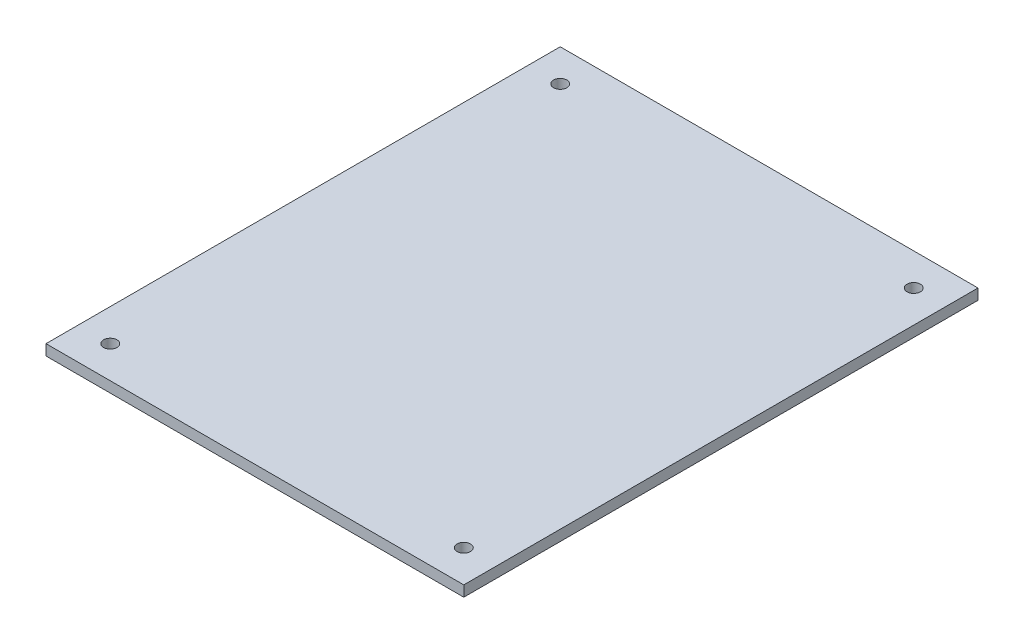
ISO-10303-21;
HEADER;
FILE_DESCRIPTION(('STEP AP214'),'2;1');
FILE_NAME('part.step','',(''),(''),'','','');
FILE_SCHEMA(('AUTOMOTIVE_DESIGN { 1 0 10303 214 1 1 1 1 }'));
ENDSEC;
DATA;
#1=APPLICATION_CONTEXT('core data for automotive mechanical design processes');
#2=APPLICATION_PROTOCOL_DEFINITION('international standard','automotive_design',2000,#1);
#3=PRODUCT_CONTEXT('',#1,'mechanical');
#4=PRODUCT('Part','Part','',(#3));
#5=PRODUCT_RELATED_PRODUCT_CATEGORY('part','',(#4));
#6=PRODUCT_DEFINITION_FORMATION('','',#4);
#7=PRODUCT_DEFINITION_CONTEXT('part definition',#1,'design');
#8=PRODUCT_DEFINITION('design','',#6,#7);
#9=PRODUCT_DEFINITION_SHAPE('','',#8);
#10=(LENGTH_UNIT() NAMED_UNIT(*) SI_UNIT(.MILLI.,.METRE.));
#11=(NAMED_UNIT(*) PLANE_ANGLE_UNIT() SI_UNIT($,.RADIAN.));
#12=(NAMED_UNIT(*) SI_UNIT($,.STERADIAN.) SOLID_ANGLE_UNIT());
#13=UNCERTAINTY_MEASURE_WITH_UNIT(LENGTH_MEASURE(1.E-05),#10,'distance_accuracy_value','');
#14=(GEOMETRIC_REPRESENTATION_CONTEXT(3) GLOBAL_UNCERTAINTY_ASSIGNED_CONTEXT((#13)) GLOBAL_UNIT_ASSIGNED_CONTEXT((#10,
#11,#12)) REPRESENTATION_CONTEXT('',''));
#15=CARTESIAN_POINT('',(0.,0.,0.));
#16=DIRECTION('',(0.,0.,1.));
#17=DIRECTION('',(1.,0.,0.));
#18=AXIS2_PLACEMENT_3D('',#15,#16,#17);
#19=CARTESIAN_POINT('',(0.,2.54,0.));
#20=DIRECTION('',(0.,1.,0.));
#21=DIRECTION('',(0.,0.,1.));
#22=AXIS2_PLACEMENT_3D('',#19,#20,#21);
#23=PLANE('',#22);
#24=CARTESIAN_POINT('',(-49.6099010012668,2.54,45.3396006384747));
#25=DIRECTION('',(0.,1.,0.));
#26=DIRECTION('',(0.,0.,1.));
#27=AXIS2_PLACEMENT_3D('',#24,#25,#26);
#28=CIRCLE('',#27,1.5875);
#29=CARTESIAN_POINT('',(-49.6099010012668,2.54,46.9271006384747));
#30=VERTEX_POINT('',#29);
#31=EDGE_CURVE('E142',#30,#30,#28,.T.);
#32=ORIENTED_EDGE('',*,*,#31,.F.);
#33=EDGE_LOOP('',(#32));
#34=FACE_BOUND('',#33,.T.);
#35=CARTESIAN_POINT('',(34.2100989987332,2.54,-61.3403993615253));
#36=DIRECTION('',(0.,1.,0.));
#37=DIRECTION('',(0.,0.,1.));
#38=AXIS2_PLACEMENT_3D('',#35,#36,#37);
#39=CIRCLE('',#38,1.5875);
#40=CARTESIAN_POINT('',(34.2100989987332,2.54,-59.7528993615253));
#41=VERTEX_POINT('',#40);
#42=EDGE_CURVE('E112',#41,#41,#39,.T.);
#43=ORIENTED_EDGE('',*,*,#42,.F.);
#44=EDGE_LOOP('',(#43));
#45=FACE_BOUND('',#44,.T.);
#46=DIRECTION('',(0.,0.,1.));
#47=VECTOR('',#46,1.);
#48=CARTESIAN_POINT('',(-57.2299010012668,2.54,-68.9603993615253));
#49=LINE('',#48,#47);
#50=CARTESIAN_POINT('',(-57.2299010012668,2.54,-68.9603993615253));
#51=VERTEX_POINT('',#50);
#52=CARTESIAN_POINT('',(-57.2299010012668,2.54,52.9596006384747));
#53=VERTEX_POINT('',#52);
#54=EDGE_CURVE('E92',#51,#53,#49,.T.);
#55=ORIENTED_EDGE('',*,*,#54,.T.);
#56=DIRECTION('',(1.,0.,0.));
#57=VECTOR('',#56,1.);
#58=CARTESIAN_POINT('',(-57.2299010012668,2.54,52.9596006384747));
#59=LINE('',#58,#57);
#60=CARTESIAN_POINT('',(41.8300989987332,2.54,52.9596006384747));
#61=VERTEX_POINT('',#60);
#62=EDGE_CURVE('E87',#53,#61,#59,.T.);
#63=ORIENTED_EDGE('',*,*,#62,.T.);
#64=DIRECTION('',(0.,0.,-1.));
#65=VECTOR('',#64,1.);
#66=CARTESIAN_POINT('',(41.8300989987332,2.54,-68.9603993615253));
#67=LINE('',#66,#65);
#68=CARTESIAN_POINT('',(41.8300989987332,2.54,-68.9603993615253));
#69=VERTEX_POINT('',#68);
#70=EDGE_CURVE('E90',#61,#69,#67,.T.);
#71=ORIENTED_EDGE('',*,*,#70,.T.);
#72=DIRECTION('',(-1.,0.,0.));
#73=VECTOR('',#72,1.);
#74=CARTESIAN_POINT('',(-57.2299010012668,2.54,-68.9603993615253));
#75=LINE('',#74,#73);
#76=EDGE_CURVE('E57',#69,#51,#75,.T.);
#77=ORIENTED_EDGE('',*,*,#76,.T.);
#78=EDGE_LOOP('',(#55,#63,#71,#77));
#79=FACE_BOUND('',#78,.T.);
#80=CARTESIAN_POINT('',(-49.6099010012668,2.54,-61.3403993615253));
#81=DIRECTION('',(0.,1.,0.));
#82=DIRECTION('',(0.,0.,1.));
#83=AXIS2_PLACEMENT_3D('',#80,#81,#82);
#84=CIRCLE('',#83,1.5875);
#85=CARTESIAN_POINT('',(-49.6099010012668,2.54,-59.7528993615253));
#86=VERTEX_POINT('',#85);
#87=EDGE_CURVE('E134',#86,#86,#84,.T.);
#88=ORIENTED_EDGE('',*,*,#87,.F.);
#89=EDGE_LOOP('',(#88));
#90=FACE_BOUND('',#89,.T.);
#91=CARTESIAN_POINT('',(34.2100989987332,2.54,45.3396006384747));
#92=DIRECTION('',(0.,1.,0.));
#93=DIRECTION('',(0.,0.,1.));
#94=AXIS2_PLACEMENT_3D('',#91,#92,#93);
#95=CIRCLE('',#94,1.5875);
#96=CARTESIAN_POINT('',(34.2100989987332,2.54,46.9271006384747));
#97=VERTEX_POINT('',#96);
#98=EDGE_CURVE('E150',#97,#97,#95,.T.);
#99=ORIENTED_EDGE('',*,*,#98,.F.);
#100=EDGE_LOOP('',(#99));
#101=FACE_BOUND('',#100,.T.);
#102=ADVANCED_FACE('F39',(#34,#45,#79,#90,#101),#23,.T.);
#103=CARTESIAN_POINT('',(0.,0.,0.));
#104=DIRECTION('',(0.,1.,0.));
#105=DIRECTION('',(0.,0.,1.));
#106=AXIS2_PLACEMENT_3D('',#103,#104,#105);
#107=PLANE('',#106);
#108=DIRECTION('',(0.,0.,1.));
#109=VECTOR('',#108,1.);
#110=CARTESIAN_POINT('',(-57.2299010012668,0.,-68.9603993615253));
#111=LINE('',#110,#109);
#112=CARTESIAN_POINT('',(-57.2299010012668,0.,-68.9603993615253));
#113=VERTEX_POINT('',#112);
#114=CARTESIAN_POINT('',(-57.2299010012668,0.,52.9596006384747));
#115=VERTEX_POINT('',#114);
#116=EDGE_CURVE('E108',#113,#115,#111,.T.);
#117=ORIENTED_EDGE('',*,*,#116,.F.);
#118=DIRECTION('',(-1.,0.,0.));
#119=VECTOR('',#118,1.);
#120=CARTESIAN_POINT('',(-57.2299010012668,0.,-68.9603993615253));
#121=LINE('',#120,#119);
#122=CARTESIAN_POINT('',(41.8300989987332,0.,-68.9603993615253));
#123=VERTEX_POINT('',#122);
#124=EDGE_CURVE('E80',#123,#113,#121,.T.);
#125=ORIENTED_EDGE('',*,*,#124,.F.);
#126=DIRECTION('',(0.,0.,-1.));
#127=VECTOR('',#126,1.);
#128=CARTESIAN_POINT('',(41.8300989987332,0.,-68.9603993615253));
#129=LINE('',#128,#127);
#130=CARTESIAN_POINT('',(41.8300989987332,0.,52.9596006384747));
#131=VERTEX_POINT('',#130);
#132=EDGE_CURVE('E74',#131,#123,#129,.T.);
#133=ORIENTED_EDGE('',*,*,#132,.F.);
#134=DIRECTION('',(1.,0.,0.));
#135=VECTOR('',#134,1.);
#136=CARTESIAN_POINT('',(-57.2299010012668,0.,52.9596006384747));
#137=LINE('',#136,#135);
#138=EDGE_CURVE('E97',#115,#131,#137,.T.);
#139=ORIENTED_EDGE('',*,*,#138,.F.);
#140=EDGE_LOOP('',(#117,#125,#133,#139));
#141=FACE_BOUND('',#140,.T.);
#142=CARTESIAN_POINT('',(34.2100989987332,0.,-61.3403993615253));
#143=DIRECTION('',(0.,1.,0.));
#144=DIRECTION('',(0.,0.,1.));
#145=AXIS2_PLACEMENT_3D('',#142,#143,#144);
#146=CIRCLE('',#145,1.5875);
#147=CARTESIAN_POINT('',(34.2100989987332,0.,-59.7528993615253));
#148=VERTEX_POINT('',#147);
#149=EDGE_CURVE('E130',#148,#148,#146,.T.);
#150=ORIENTED_EDGE('',*,*,#149,.T.);
#151=EDGE_LOOP('',(#150));
#152=FACE_BOUND('',#151,.T.);
#153=CARTESIAN_POINT('',(-49.6099010012668,0.,-61.3403993615253));
#154=DIRECTION('',(0.,1.,0.));
#155=DIRECTION('',(0.,0.,1.));
#156=AXIS2_PLACEMENT_3D('',#153,#154,#155);
#157=CIRCLE('',#156,1.5875);
#158=CARTESIAN_POINT('',(-49.6099010012668,0.,-59.7528993615253));
#159=VERTEX_POINT('',#158);
#160=EDGE_CURVE('E138',#159,#159,#157,.T.);
#161=ORIENTED_EDGE('',*,*,#160,.T.);
#162=EDGE_LOOP('',(#161));
#163=FACE_BOUND('',#162,.T.);
#164=CARTESIAN_POINT('',(-49.6099010012668,0.,45.3396006384747));
#165=DIRECTION('',(0.,1.,0.));
#166=DIRECTION('',(0.,0.,1.));
#167=AXIS2_PLACEMENT_3D('',#164,#165,#166);
#168=CIRCLE('',#167,1.5875);
#169=CARTESIAN_POINT('',(-49.6099010012668,0.,46.9271006384747));
#170=VERTEX_POINT('',#169);
#171=EDGE_CURVE('E146',#170,#170,#168,.T.);
#172=ORIENTED_EDGE('',*,*,#171,.T.);
#173=EDGE_LOOP('',(#172));
#174=FACE_BOUND('',#173,.T.);
#175=CARTESIAN_POINT('',(34.2100989987332,0.,45.3396006384747));
#176=DIRECTION('',(0.,1.,0.));
#177=DIRECTION('',(0.,0.,1.));
#178=AXIS2_PLACEMENT_3D('',#175,#176,#177);
#179=CIRCLE('',#178,1.5875);
#180=CARTESIAN_POINT('',(34.2100989987332,0.,46.9271006384747));
#181=VERTEX_POINT('',#180);
#182=EDGE_CURVE('E154',#181,#181,#179,.T.);
#183=ORIENTED_EDGE('',*,*,#182,.T.);
#184=EDGE_LOOP('',(#183));
#185=FACE_BOUND('',#184,.T.);
#186=ADVANCED_FACE('F125',(#141,#152,#163,#174,#185),#107,.F.);
#187=CARTESIAN_POINT('',(-57.2299010012668,2.54,-68.9603993615253));
#188=DIRECTION('',(1.,0.,0.));
#189=DIRECTION('',(0.,0.,-1.));
#190=AXIS2_PLACEMENT_3D('',#187,#188,#189);
#191=PLANE('',#190);
#192=ORIENTED_EDGE('',*,*,#116,.T.);
#193=DIRECTION('',(0.,-1.,0.));
#194=VECTOR('',#193,1.);
#195=CARTESIAN_POINT('',(-57.2299010012668,2.54,52.9596006384747));
#196=LINE('',#195,#194);
#197=EDGE_CURVE('E11',#53,#115,#196,.T.);
#198=ORIENTED_EDGE('',*,*,#197,.F.);
#199=ORIENTED_EDGE('',*,*,#54,.F.);
#200=DIRECTION('',(0.,-1.,0.));
#201=VECTOR('',#200,1.);
#202=CARTESIAN_POINT('',(-57.2299010012668,2.54,-68.9603993615253));
#203=LINE('',#202,#201);
#204=EDGE_CURVE('E104',#51,#113,#203,.T.);
#205=ORIENTED_EDGE('',*,*,#204,.T.);
#206=EDGE_LOOP('',(#192,#198,#199,#205));
#207=FACE_BOUND('',#206,.T.);
#208=ADVANCED_FACE('F41',(#207),#191,.F.);
#209=CARTESIAN_POINT('',(-57.2299010012668,2.54,52.9596006384747));
#210=DIRECTION('',(0.,0.,-1.));
#211=DIRECTION('',(-1.,0.,0.));
#212=AXIS2_PLACEMENT_3D('',#209,#210,#211);
#213=PLANE('',#212);
#214=ORIENTED_EDGE('',*,*,#138,.T.);
#215=DIRECTION('',(0.,-1.,0.));
#216=VECTOR('',#215,1.);
#217=CARTESIAN_POINT('',(41.8300989987332,2.54,52.9596006384747));
#218=LINE('',#217,#216);
#219=EDGE_CURVE('E49',#61,#131,#218,.T.);
#220=ORIENTED_EDGE('',*,*,#219,.F.);
#221=ORIENTED_EDGE('',*,*,#62,.F.);
#222=ORIENTED_EDGE('',*,*,#197,.T.);
#223=EDGE_LOOP('',(#214,#220,#221,#222));
#224=FACE_BOUND('',#223,.T.);
#225=ADVANCED_FACE('F96',(#224),#213,.F.);
#226=CARTESIAN_POINT('',(41.8300989987332,2.54,-68.9603993615253));
#227=DIRECTION('',(-1.,0.,0.));
#228=DIRECTION('',(0.,0.,1.));
#229=AXIS2_PLACEMENT_3D('',#226,#227,#228);
#230=PLANE('',#229);
#231=ORIENTED_EDGE('',*,*,#132,.T.);
#232=DIRECTION('',(0.,-1.,0.));
#233=VECTOR('',#232,1.);
#234=CARTESIAN_POINT('',(41.8300989987332,2.54,-68.9603993615253));
#235=LINE('',#234,#233);
#236=EDGE_CURVE('E99',#69,#123,#235,.T.);
#237=ORIENTED_EDGE('',*,*,#236,.F.);
#238=ORIENTED_EDGE('',*,*,#70,.F.);
#239=ORIENTED_EDGE('',*,*,#219,.T.);
#240=EDGE_LOOP('',(#231,#237,#238,#239));
#241=FACE_BOUND('',#240,.T.);
#242=ADVANCED_FACE('F100',(#241),#230,.F.);
#243=CARTESIAN_POINT('',(-57.2299010012668,2.54,-68.9603993615253));
#244=DIRECTION('',(0.,0.,1.));
#245=DIRECTION('',(1.,0.,0.));
#246=AXIS2_PLACEMENT_3D('',#243,#244,#245);
#247=PLANE('',#246);
#248=ORIENTED_EDGE('',*,*,#124,.T.);
#249=ORIENTED_EDGE('',*,*,#204,.F.);
#250=ORIENTED_EDGE('',*,*,#76,.F.);
#251=ORIENTED_EDGE('',*,*,#236,.T.);
#252=EDGE_LOOP('',(#248,#249,#250,#251));
#253=FACE_BOUND('',#252,.T.);
#254=ADVANCED_FACE('F122',(#253),#247,.F.);
#255=CARTESIAN_POINT('',(34.2100989987332,2.54,-61.3403993615253));
#256=DIRECTION('',(0.,-1.,0.));
#257=DIRECTION('',(0.,0.,-1.));
#258=AXIS2_PLACEMENT_3D('',#255,#256,#257);
#259=CYLINDRICAL_SURFACE('',#258,1.5875);
#260=ORIENTED_EDGE('',*,*,#42,.T.);
#261=EDGE_LOOP('',(#260));
#262=FACE_BOUND('',#261,.T.);
#263=ORIENTED_EDGE('',*,*,#149,.F.);
#264=EDGE_LOOP('',(#263));
#265=FACE_BOUND('',#264,.T.);
#266=ADVANCED_FACE('F175',(#262,#265),#259,.F.);
#267=CARTESIAN_POINT('',(-49.6099010012668,2.54,-61.3403993615253));
#268=DIRECTION('',(0.,-1.,0.));
#269=DIRECTION('',(0.,0.,-1.));
#270=AXIS2_PLACEMENT_3D('',#267,#268,#269);
#271=CYLINDRICAL_SURFACE('',#270,1.5875);
#272=ORIENTED_EDGE('',*,*,#87,.T.);
#273=EDGE_LOOP('',(#272));
#274=FACE_BOUND('',#273,.T.);
#275=ORIENTED_EDGE('',*,*,#160,.F.);
#276=EDGE_LOOP('',(#275));
#277=FACE_BOUND('',#276,.T.);
#278=ADVANCED_FACE('F221',(#274,#277),#271,.F.);
#279=CARTESIAN_POINT('',(-49.6099010012668,2.54,45.3396006384747));
#280=DIRECTION('',(0.,-1.,0.));
#281=DIRECTION('',(0.,0.,-1.));
#282=AXIS2_PLACEMENT_3D('',#279,#280,#281);
#283=CYLINDRICAL_SURFACE('',#282,1.5875);
#284=ORIENTED_EDGE('',*,*,#31,.T.);
#285=EDGE_LOOP('',(#284));
#286=FACE_BOUND('',#285,.T.);
#287=ORIENTED_EDGE('',*,*,#171,.F.);
#288=EDGE_LOOP('',(#287));
#289=FACE_BOUND('',#288,.T.);
#290=ADVANCED_FACE('F229',(#286,#289),#283,.F.);
#291=CARTESIAN_POINT('',(34.2100989987332,2.54,45.3396006384747));
#292=DIRECTION('',(0.,-1.,0.));
#293=DIRECTION('',(0.,0.,-1.));
#294=AXIS2_PLACEMENT_3D('',#291,#292,#293);
#295=CYLINDRICAL_SURFACE('',#294,1.5875);
#296=ORIENTED_EDGE('',*,*,#98,.T.);
#297=EDGE_LOOP('',(#296));
#298=FACE_BOUND('',#297,.T.);
#299=ORIENTED_EDGE('',*,*,#182,.F.);
#300=EDGE_LOOP('',(#299));
#301=FACE_BOUND('',#300,.T.);
#302=ADVANCED_FACE('F162',(#298,#301),#295,.F.);
#303=CLOSED_SHELL('',(#102,#186,#208,#225,#242,#254,#266,#278,#290,#302));
#304=MANIFOLD_SOLID_BREP('B2',#303);
#305=ADVANCED_BREP_SHAPE_REPRESENTATION('',(#18,#304),#14);
#306=SHAPE_DEFINITION_REPRESENTATION(#9,#305);
ENDSEC;
END-ISO-10303-21;
